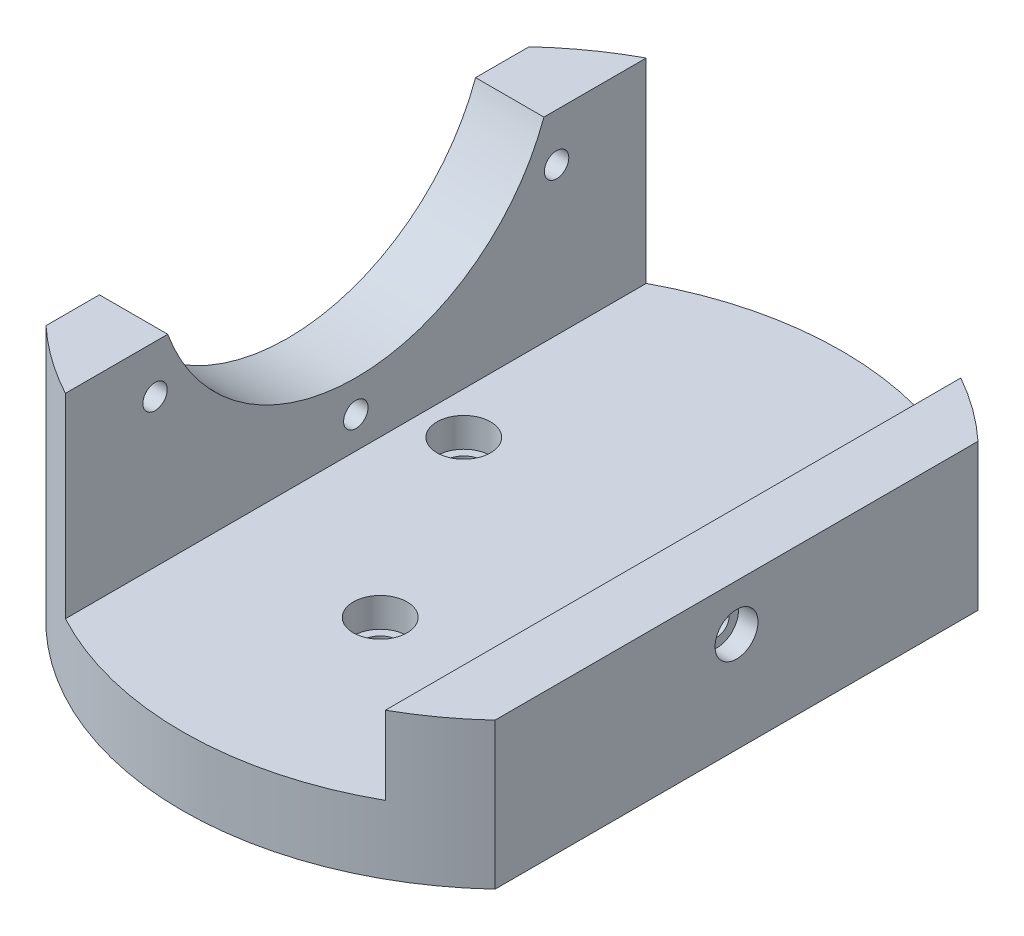
ISO-10303-21;
HEADER;
FILE_DESCRIPTION(('STEP AP214'),'2;1');
FILE_NAME('part.step','',(''),(''),'','','');
FILE_SCHEMA(('AUTOMOTIVE_DESIGN { 1 0 10303 214 1 1 1 1 }'));
ENDSEC;
DATA;
#1=APPLICATION_CONTEXT('core data for automotive mechanical design processes');
#2=APPLICATION_PROTOCOL_DEFINITION('international standard','automotive_design',2000,#1);
#3=PRODUCT_CONTEXT('',#1,'mechanical');
#4=PRODUCT('Part','Part','',(#3));
#5=PRODUCT_RELATED_PRODUCT_CATEGORY('part','',(#4));
#6=PRODUCT_DEFINITION_FORMATION('','',#4);
#7=PRODUCT_DEFINITION_CONTEXT('part definition',#1,'design');
#8=PRODUCT_DEFINITION('design','',#6,#7);
#9=PRODUCT_DEFINITION_SHAPE('','',#8);
#10=(LENGTH_UNIT() NAMED_UNIT(*) SI_UNIT(.MILLI.,.METRE.));
#11=(NAMED_UNIT(*) PLANE_ANGLE_UNIT() SI_UNIT($,.RADIAN.));
#12=(NAMED_UNIT(*) SI_UNIT($,.STERADIAN.) SOLID_ANGLE_UNIT());
#13=UNCERTAINTY_MEASURE_WITH_UNIT(LENGTH_MEASURE(1.E-05),#10,'distance_accuracy_value','');
#14=(GEOMETRIC_REPRESENTATION_CONTEXT(3) GLOBAL_UNCERTAINTY_ASSIGNED_CONTEXT((#13)) GLOBAL_UNIT_ASSIGNED_CONTEXT((#10,
#11,#12)) REPRESENTATION_CONTEXT('',''));
#15=CARTESIAN_POINT('',(0.,0.,0.));
#16=DIRECTION('',(0.,0.,1.));
#17=DIRECTION('',(1.,0.,0.));
#18=AXIS2_PLACEMENT_3D('',#15,#16,#17);
#19=CARTESIAN_POINT('',(15.5,10.25,0.));
#20=DIRECTION('',(1.,0.,0.));
#21=DIRECTION('',(0.,0.,-1.));
#22=AXIS2_PLACEMENT_3D('',#19,#20,#21);
#23=CYLINDRICAL_SURFACE('',#22,1.25);
#24=CARTESIAN_POINT('',(16.5,10.25,0.));
#25=DIRECTION('',(1.,0.,0.));
#26=DIRECTION('',(0.,0.,-1.));
#27=AXIS2_PLACEMENT_3D('',#24,#25,#26);
#28=CIRCLE('',#27,1.25);
#29=CARTESIAN_POINT('',(16.5,10.25,-1.25));
#30=VERTEX_POINT('',#29);
#31=EDGE_CURVE('E264',#30,#30,#28,.T.);
#32=ORIENTED_EDGE('',*,*,#31,.F.);
#33=EDGE_LOOP('',(#32));
#34=FACE_BOUND('',#33,.T.);
#35=CARTESIAN_POINT('',(21.,10.25,0.));
#36=DIRECTION('',(1.,0.,0.));
#37=DIRECTION('',(0.,0.,-1.));
#38=AXIS2_PLACEMENT_3D('',#35,#36,#37);
#39=CIRCLE('',#38,1.25);
#40=CARTESIAN_POINT('',(21.,10.25,-1.25));
#41=VERTEX_POINT('',#40);
#42=EDGE_CURVE('E45',#41,#41,#39,.F.);
#43=ORIENTED_EDGE('',*,*,#42,.F.);
#44=EDGE_LOOP('',(#43));
#45=FACE_BOUND('',#44,.T.);
#46=ADVANCED_FACE('F41',(#34,#45),#23,.F.);
#47=CARTESIAN_POINT('',(0.,7.,0.));
#48=DIRECTION('',(0.,1.,0.));
#49=DIRECTION('',(0.,0.,1.));
#50=AXIS2_PLACEMENT_3D('',#47,#48,#49);
#51=PLANE('',#50);
#52=CARTESIAN_POINT('',(-11.6913429510898,7.,-6.75000000000014));
#53=DIRECTION('',(0.,1.,0.));
#54=DIRECTION('',(0.,0.,1.));
#55=AXIS2_PLACEMENT_3D('',#52,#53,#54);
#56=CIRCLE('',#55,2.75);
#57=CARTESIAN_POINT('',(-11.6913429510898,7.,-4.00000000000014));
#58=VERTEX_POINT('',#57);
#59=EDGE_CURVE('E205',#58,#58,#56,.T.);
#60=ORIENTED_EDGE('',*,*,#59,.F.);
#61=EDGE_LOOP('',(#60));
#62=FACE_BOUND('',#61,.T.);
#63=CARTESIAN_POINT('',(11.6913429510899,7.,-6.74999999999997));
#64=DIRECTION('',(0.,1.,0.));
#65=DIRECTION('',(0.,0.,1.));
#66=AXIS2_PLACEMENT_3D('',#63,#64,#65);
#67=CIRCLE('',#66,2.75);
#68=CARTESIAN_POINT('',(11.6913429510899,7.,-3.99999999999998));
#69=VERTEX_POINT('',#68);
#70=EDGE_CURVE('E208',#69,#69,#67,.T.);
#71=ORIENTED_EDGE('',*,*,#70,.F.);
#72=EDGE_LOOP('',(#71));
#73=FACE_BOUND('',#72,.T.);
#74=CARTESIAN_POINT('',(0.,7.,13.5));
#75=DIRECTION('',(0.,1.,0.));
#76=DIRECTION('',(0.,0.,1.));
#77=AXIS2_PLACEMENT_3D('',#74,#75,#76);
#78=CIRCLE('',#77,2.75);
#79=CARTESIAN_POINT('',(0.,7.,16.25));
#80=VERTEX_POINT('',#79);
#81=EDGE_CURVE('E214',#80,#80,#78,.T.);
#82=ORIENTED_EDGE('',*,*,#81,.F.);
#83=EDGE_LOOP('',(#82));
#84=FACE_BOUND('',#83,.T.);
#85=CARTESIAN_POINT('',(0.,7.,0.));
#86=DIRECTION('',(0.,1.,0.));
#87=DIRECTION('',(0.,0.,1.));
#88=AXIS2_PLACEMENT_3D('',#85,#86,#87);
#89=CIRCLE('',#88,33.7790111417605);
#90=CARTESIAN_POINT('',(-16.,7.,29.7493124914708));
#91=VERTEX_POINT('',#90);
#92=CARTESIAN_POINT('',(16.5,7.,29.4749316151061));
#93=VERTEX_POINT('',#92);
#94=EDGE_CURVE('E63',#91,#93,#89,.T.);
#95=ORIENTED_EDGE('',*,*,#94,.T.);
#96=DIRECTION('',(0.,0.,1.));
#97=VECTOR('',#96,1.);
#98=CARTESIAN_POINT('',(16.5,7.,-29.4749316151061));
#99=LINE('',#98,#97);
#100=CARTESIAN_POINT('',(16.5,7.,-29.4749316151061));
#101=VERTEX_POINT('',#100);
#102=EDGE_CURVE('E58',#101,#93,#99,.T.);
#103=ORIENTED_EDGE('',*,*,#102,.F.);
#104=CARTESIAN_POINT('',(0.,7.,0.));
#105=DIRECTION('',(0.,1.,0.));
#106=DIRECTION('',(0.,0.,1.));
#107=AXIS2_PLACEMENT_3D('',#104,#105,#106);
#108=CIRCLE('',#107,33.7790111417605);
#109=CARTESIAN_POINT('',(-16.,7.,-29.7493124914708));
#110=VERTEX_POINT('',#109);
#111=EDGE_CURVE('E140',#101,#110,#108,.T.);
#112=ORIENTED_EDGE('',*,*,#111,.T.);
#113=DIRECTION('',(0.,0.,-1.));
#114=VECTOR('',#113,1.);
#115=CARTESIAN_POINT('',(-16.,7.,-29.7493124914708));
#116=LINE('',#115,#114);
#117=EDGE_CURVE('E179',#91,#110,#116,.T.);
#118=ORIENTED_EDGE('',*,*,#117,.F.);
#119=EDGE_LOOP('',(#95,#103,#112,#118));
#120=FACE_BOUND('',#119,.T.);
#121=ADVANCED_FACE('F306',(#62,#73,#84,#120),#51,.T.);
#122=CARTESIAN_POINT('',(-35.5,22.1249999999998,-20.5681033398803));
#123=DIRECTION('',(1.,0.,0.));
#124=DIRECTION('',(0.,0.,-1.));
#125=AXIS2_PLACEMENT_3D('',#122,#123,#124);
#126=CYLINDRICAL_SURFACE('',#125,1.25);
#127=CARTESIAN_POINT('',(-16.,22.1249999999998,-20.5681033398803));
#128=DIRECTION('',(1.,0.,0.));
#129=DIRECTION('',(0.,0.,-1.));
#130=AXIS2_PLACEMENT_3D('',#127,#128,#129);
#131=CIRCLE('',#130,1.25);
#132=CARTESIAN_POINT('',(-16.,22.1249999999998,-21.8181033398803));
#133=VERTEX_POINT('',#132);
#134=EDGE_CURVE('E171',#133,#133,#131,.T.);
#135=ORIENTED_EDGE('',*,*,#134,.T.);
#136=EDGE_LOOP('',(#135));
#137=FACE_BOUND('',#136,.T.);
#138=CARTESIAN_POINT('',(-21.,22.1249999999998,-20.5681033398803));
#139=DIRECTION('',(-1.,0.,0.));
#140=DIRECTION('',(0.,0.,1.));
#141=AXIS2_PLACEMENT_3D('',#138,#139,#140);
#142=CIRCLE('',#141,1.25);
#143=CARTESIAN_POINT('',(-21.,22.1249999999998,-19.3181033398803));
#144=VERTEX_POINT('',#143);
#145=EDGE_CURVE('E174',#144,#144,#142,.F.);
#146=ORIENTED_EDGE('',*,*,#145,.F.);
#147=EDGE_LOOP('',(#146));
#148=FACE_BOUND('',#147,.T.);
#149=ADVANCED_FACE('F335',(#137,#148),#126,.F.);
#150=CARTESIAN_POINT('',(-35.5,22.125,20.5681033398804));
#151=DIRECTION('',(1.,0.,0.));
#152=DIRECTION('',(0.,0.,-1.));
#153=AXIS2_PLACEMENT_3D('',#150,#151,#152);
#154=CYLINDRICAL_SURFACE('',#153,1.25);
#155=CARTESIAN_POINT('',(-16.,22.125,20.5681033398804));
#156=DIRECTION('',(1.,0.,0.));
#157=DIRECTION('',(0.,0.,-1.));
#158=AXIS2_PLACEMENT_3D('',#155,#156,#157);
#159=CIRCLE('',#158,1.25);
#160=CARTESIAN_POINT('',(-16.,22.125,19.3181033398805));
#161=VERTEX_POINT('',#160);
#162=EDGE_CURVE('E168',#161,#161,#159,.T.);
#163=ORIENTED_EDGE('',*,*,#162,.T.);
#164=EDGE_LOOP('',(#163));
#165=FACE_BOUND('',#164,.T.);
#166=CARTESIAN_POINT('',(-21.,22.125,20.5681033398804));
#167=DIRECTION('',(-1.,0.,0.));
#168=DIRECTION('',(0.,0.,1.));
#169=AXIS2_PLACEMENT_3D('',#166,#167,#168);
#170=CIRCLE('',#169,1.25);
#171=CARTESIAN_POINT('',(-21.,22.125,21.8181033398804));
#172=VERTEX_POINT('',#171);
#173=EDGE_CURVE('E260',#172,#172,#170,.F.);
#174=ORIENTED_EDGE('',*,*,#173,.F.);
#175=EDGE_LOOP('',(#174));
#176=FACE_BOUND('',#175,.T.);
#177=ADVANCED_FACE('F369',(#165,#176),#154,.F.);
#178=CARTESIAN_POINT('',(-35.5,10.25,0.));
#179=DIRECTION('',(1.,0.,0.));
#180=DIRECTION('',(0.,0.,-1.));
#181=AXIS2_PLACEMENT_3D('',#178,#179,#180);
#182=CYLINDRICAL_SURFACE('',#181,1.25);
#183=CARTESIAN_POINT('',(-16.,10.25,0.));
#184=DIRECTION('',(1.,0.,0.));
#185=DIRECTION('',(0.,0.,-1.));
#186=AXIS2_PLACEMENT_3D('',#183,#184,#185);
#187=CIRCLE('',#186,1.25);
#188=CARTESIAN_POINT('',(-16.,10.25,-1.25));
#189=VERTEX_POINT('',#188);
#190=EDGE_CURVE('E164',#189,#189,#187,.T.);
#191=ORIENTED_EDGE('',*,*,#190,.T.);
#192=EDGE_LOOP('',(#191));
#193=FACE_BOUND('',#192,.T.);
#194=CARTESIAN_POINT('',(-21.,10.25,0.));
#195=DIRECTION('',(-1.,0.,0.));
#196=DIRECTION('',(0.,0.,1.));
#197=AXIS2_PLACEMENT_3D('',#194,#195,#196);
#198=CIRCLE('',#197,1.25);
#199=CARTESIAN_POINT('',(-21.,10.25,1.25));
#200=VERTEX_POINT('',#199);
#201=EDGE_CURVE('E152',#200,#200,#198,.F.);
#202=ORIENTED_EDGE('',*,*,#201,.F.);
#203=EDGE_LOOP('',(#202));
#204=FACE_BOUND('',#203,.T.);
#205=ADVANCED_FACE('F366',(#193,#204),#182,.F.);
#206=CARTESIAN_POINT('',(0.,27.,0.));
#207=DIRECTION('',(0.,1.,0.));
#208=DIRECTION('',(0.,0.,1.));
#209=AXIS2_PLACEMENT_3D('',#206,#207,#208);
#210=PLANE('',#209);
#211=DIRECTION('',(1.,0.,0.));
#212=VECTOR('',#211,1.);
#213=CARTESIAN_POINT('',(-35.5,27.,19.2678488679977));
#214=LINE('',#213,#212);
#215=CARTESIAN_POINT('',(-23.,27.,19.2678488679977));
#216=VERTEX_POINT('',#215);
#217=CARTESIAN_POINT('',(-16.,27.,19.2678488679977));
#218=VERTEX_POINT('',#217);
#219=EDGE_CURVE('E11',#216,#218,#214,.T.);
#220=ORIENTED_EDGE('',*,*,#219,.F.);
#221=DIRECTION('',(0.,0.,1.));
#222=VECTOR('',#221,1.);
#223=CARTESIAN_POINT('',(-23.,27.,-24.7390701869569));
#224=LINE('',#223,#222);
#225=CARTESIAN_POINT('',(-23.,27.,24.7390701869569));
#226=VERTEX_POINT('',#225);
#227=EDGE_CURVE('E183',#216,#226,#224,.T.);
#228=ORIENTED_EDGE('',*,*,#227,.T.);
#229=CARTESIAN_POINT('',(0.,27.,0.));
#230=DIRECTION('',(0.,1.,0.));
#231=DIRECTION('',(0.,0.,1.));
#232=AXIS2_PLACEMENT_3D('',#229,#230,#231);
#233=CIRCLE('',#232,33.7790111417605);
#234=CARTESIAN_POINT('',(-16.,27.,29.7493124914708));
#235=VERTEX_POINT('',#234);
#236=EDGE_CURVE('E187',#226,#235,#233,.T.);
#237=ORIENTED_EDGE('',*,*,#236,.T.);
#238=DIRECTION('',(0.,0.,-1.));
#239=VECTOR('',#238,1.);
#240=CARTESIAN_POINT('',(-16.,27.,-29.7493124914708));
#241=LINE('',#240,#239);
#242=EDGE_CURVE('E190',#235,#218,#241,.T.);
#243=ORIENTED_EDGE('',*,*,#242,.T.);
#244=EDGE_LOOP('',(#220,#228,#237,#243));
#245=FACE_BOUND('',#244,.T.);
#246=ADVANCED_FACE('F311',(#245),#210,.T.);
#247=CARTESIAN_POINT('',(11.6913429510899,7.,-6.74999999999997));
#248=DIRECTION('',(0.,-1.,0.));
#249=DIRECTION('',(0.,0.,-1.));
#250=AXIS2_PLACEMENT_3D('',#247,#248,#249);
#251=CYLINDRICAL_SURFACE('',#250,1.91201949859022);
#252=CARTESIAN_POINT('',(11.6913429510899,0.,-6.74999999999997));
#253=DIRECTION('',(0.,1.,0.));
#254=DIRECTION('',(0.,0.,1.));
#255=AXIS2_PLACEMENT_3D('',#252,#253,#254);
#256=CIRCLE('',#255,1.91201949859022);
#257=CARTESIAN_POINT('',(11.6913429510899,0.,-4.83798050140976));
#258=VERTEX_POINT('',#257);
#259=EDGE_CURVE('E226',#258,#258,#256,.T.);
#260=ORIENTED_EDGE('',*,*,#259,.F.);
#261=EDGE_LOOP('',(#260));
#262=FACE_BOUND('',#261,.T.);
#263=CARTESIAN_POINT('',(11.6913429510899,4.,-6.74999999999997));
#264=DIRECTION('',(0.,1.,0.));
#265=DIRECTION('',(0.,0.,1.));
#266=AXIS2_PLACEMENT_3D('',#263,#264,#265);
#267=CIRCLE('',#266,1.91201949859022);
#268=CARTESIAN_POINT('',(11.6913429510899,4.,-4.83798050140976));
#269=VERTEX_POINT('',#268);
#270=EDGE_CURVE('E223',#269,#269,#267,.T.);
#271=ORIENTED_EDGE('',*,*,#270,.T.);
#272=EDGE_LOOP('',(#271));
#273=FACE_BOUND('',#272,.T.);
#274=ADVANCED_FACE('F420',(#262,#273),#251,.F.);
#275=CARTESIAN_POINT('',(0.,7.,13.5));
#276=DIRECTION('',(0.,-1.,0.));
#277=DIRECTION('',(0.,0.,-1.));
#278=AXIS2_PLACEMENT_3D('',#275,#276,#277);
#279=CYLINDRICAL_SURFACE('',#278,1.91201949859022);
#280=CARTESIAN_POINT('',(0.,0.,13.5));
#281=DIRECTION('',(0.,1.,0.));
#282=DIRECTION('',(0.,0.,1.));
#283=AXIS2_PLACEMENT_3D('',#280,#281,#282);
#284=CIRCLE('',#283,1.91201949859022);
#285=CARTESIAN_POINT('',(0.,0.,15.4120194985902));
#286=VERTEX_POINT('',#285);
#287=EDGE_CURVE('E222',#286,#286,#284,.T.);
#288=ORIENTED_EDGE('',*,*,#287,.F.);
#289=EDGE_LOOP('',(#288));
#290=FACE_BOUND('',#289,.T.);
#291=CARTESIAN_POINT('',(0.,4.,13.5));
#292=DIRECTION('',(0.,1.,0.));
#293=DIRECTION('',(0.,0.,1.));
#294=AXIS2_PLACEMENT_3D('',#291,#292,#293);
#295=CIRCLE('',#294,1.91201949859022);
#296=CARTESIAN_POINT('',(0.,4.,15.4120194985902));
#297=VERTEX_POINT('',#296);
#298=EDGE_CURVE('E252',#297,#297,#295,.T.);
#299=ORIENTED_EDGE('',*,*,#298,.T.);
#300=EDGE_LOOP('',(#299));
#301=FACE_BOUND('',#300,.T.);
#302=ADVANCED_FACE('F416',(#290,#301),#279,.F.);
#303=CARTESIAN_POINT('',(-11.6913429510898,7.,-6.75000000000014));
#304=DIRECTION('',(0.,-1.,0.));
#305=DIRECTION('',(0.,0.,-1.));
#306=AXIS2_PLACEMENT_3D('',#303,#304,#305);
#307=CYLINDRICAL_SURFACE('',#306,1.91201949859022);
#308=CARTESIAN_POINT('',(-11.6913429510898,0.,-6.75000000000014));
#309=DIRECTION('',(0.,1.,0.));
#310=DIRECTION('',(0.,0.,1.));
#311=AXIS2_PLACEMENT_3D('',#308,#309,#310);
#312=CIRCLE('',#311,1.91201949859022);
#313=CARTESIAN_POINT('',(-11.6913429510898,0.,-4.83798050140992));
#314=VERTEX_POINT('',#313);
#315=EDGE_CURVE('E219',#314,#314,#312,.T.);
#316=ORIENTED_EDGE('',*,*,#315,.F.);
#317=EDGE_LOOP('',(#316));
#318=FACE_BOUND('',#317,.T.);
#319=CARTESIAN_POINT('',(-11.6913429510898,4.,-6.75000000000014));
#320=DIRECTION('',(0.,1.,0.));
#321=DIRECTION('',(0.,0.,1.));
#322=AXIS2_PLACEMENT_3D('',#319,#320,#321);
#323=CIRCLE('',#322,1.91201949859022);
#324=CARTESIAN_POINT('',(-11.6913429510898,4.,-4.83798050140992));
#325=VERTEX_POINT('',#324);
#326=EDGE_CURVE('E204',#325,#325,#323,.T.);
#327=ORIENTED_EDGE('',*,*,#326,.T.);
#328=EDGE_LOOP('',(#327));
#329=FACE_BOUND('',#328,.T.);
#330=ADVANCED_FACE('F413',(#318,#329),#307,.F.);
#331=CARTESIAN_POINT('',(0.,0.,0.));
#332=DIRECTION('',(0.,1.,0.));
#333=DIRECTION('',(0.,0.,1.));
#334=AXIS2_PLACEMENT_3D('',#331,#332,#333);
#335=PLANE('',#334);
#336=CARTESIAN_POINT('',(0.,0.,0.));
#337=DIRECTION('',(0.,1.,0.));
#338=DIRECTION('',(0.,0.,1.));
#339=AXIS2_PLACEMENT_3D('',#336,#337,#338);
#340=CIRCLE('',#339,33.7790111417605);
#341=CARTESIAN_POINT('',(23.,0.,-24.7390701869569));
#342=VERTEX_POINT('',#341);
#343=CARTESIAN_POINT('',(-23.,0.,-24.7390701869569));
#344=VERTEX_POINT('',#343);
#345=EDGE_CURVE('E229',#342,#344,#340,.T.);
#346=ORIENTED_EDGE('',*,*,#345,.F.);
#347=DIRECTION('',(0.,0.,-1.));
#348=VECTOR('',#347,1.);
#349=CARTESIAN_POINT('',(23.,0.,24.7390701869569));
#350=LINE('',#349,#348);
#351=CARTESIAN_POINT('',(23.,0.,24.7390701869569));
#352=VERTEX_POINT('',#351);
#353=EDGE_CURVE('E231',#352,#342,#350,.T.);
#354=ORIENTED_EDGE('',*,*,#353,.F.);
#355=CARTESIAN_POINT('',(0.,0.,0.));
#356=DIRECTION('',(0.,1.,0.));
#357=DIRECTION('',(0.,0.,1.));
#358=AXIS2_PLACEMENT_3D('',#355,#356,#357);
#359=CIRCLE('',#358,33.7790111417605);
#360=CARTESIAN_POINT('',(-23.,0.,24.7390701869569));
#361=VERTEX_POINT('',#360);
#362=EDGE_CURVE('E237',#361,#352,#359,.T.);
#363=ORIENTED_EDGE('',*,*,#362,.F.);
#364=DIRECTION('',(0.,0.,1.));
#365=VECTOR('',#364,1.);
#366=CARTESIAN_POINT('',(-23.,0.,-24.7390701869569));
#367=LINE('',#366,#365);
#368=EDGE_CURVE('E235',#344,#361,#367,.T.);
#369=ORIENTED_EDGE('',*,*,#368,.F.);
#370=EDGE_LOOP('',(#346,#354,#363,#369));
#371=FACE_BOUND('',#370,.T.);
#372=ORIENTED_EDGE('',*,*,#259,.T.);
#373=EDGE_LOOP('',(#372));
#374=FACE_BOUND('',#373,.T.);
#375=ORIENTED_EDGE('',*,*,#287,.T.);
#376=EDGE_LOOP('',(#375));
#377=FACE_BOUND('',#376,.T.);
#378=ORIENTED_EDGE('',*,*,#315,.T.);
#379=EDGE_LOOP('',(#378));
#380=FACE_BOUND('',#379,.T.);
#381=ADVANCED_FACE('F287',(#371,#374,#377,#380),#335,.F.);
#382=CARTESIAN_POINT('',(0.,7.,0.));
#383=DIRECTION('',(0.,-1.,0.));
#384=DIRECTION('',(0.,0.,-1.));
#385=AXIS2_PLACEMENT_3D('',#382,#383,#384);
#386=CYLINDRICAL_SURFACE('',#385,33.7790111417605);
#387=ORIENTED_EDGE('',*,*,#345,.T.);
#388=DIRECTION('',(0.,-1.,0.));
#389=VECTOR('',#388,1.);
#390=CARTESIAN_POINT('',(-23.,7.,-24.7390701869569));
#391=LINE('',#390,#389);
#392=CARTESIAN_POINT('',(-23.,27.,-24.7390701869569));
#393=VERTEX_POINT('',#392);
#394=EDGE_CURVE('E247',#393,#344,#391,.T.);
#395=ORIENTED_EDGE('',*,*,#394,.F.);
#396=CARTESIAN_POINT('',(0.,27.,0.));
#397=DIRECTION('',(0.,1.,0.));
#398=DIRECTION('',(0.,0.,1.));
#399=AXIS2_PLACEMENT_3D('',#396,#397,#398);
#400=CIRCLE('',#399,33.7790111417605);
#401=CARTESIAN_POINT('',(-16.,27.,-29.7493124914708));
#402=VERTEX_POINT('',#401);
#403=EDGE_CURVE('E180',#402,#393,#400,.T.);
#404=ORIENTED_EDGE('',*,*,#403,.F.);
#405=DIRECTION('',(0.,-1.,0.));
#406=VECTOR('',#405,1.);
#407=CARTESIAN_POINT('',(-16.,27.,-29.7493124914708));
#408=LINE('',#407,#406);
#409=EDGE_CURVE('E193',#402,#110,#408,.T.);
#410=ORIENTED_EDGE('',*,*,#409,.T.);
#411=ORIENTED_EDGE('',*,*,#111,.F.);
#412=DIRECTION('',(0.,-1.,0.));
#413=VECTOR('',#412,1.);
#414=CARTESIAN_POINT('',(16.5,15.,-29.4749316151061));
#415=LINE('',#414,#413);
#416=CARTESIAN_POINT('',(16.5,15.,-29.4749316151061));
#417=VERTEX_POINT('',#416);
#418=EDGE_CURVE('E121',#417,#101,#415,.T.);
#419=ORIENTED_EDGE('',*,*,#418,.F.);
#420=CARTESIAN_POINT('',(0.,15.,0.));
#421=DIRECTION('',(0.,1.,0.));
#422=DIRECTION('',(0.,0.,1.));
#423=AXIS2_PLACEMENT_3D('',#420,#421,#422);
#424=CIRCLE('',#423,33.7790111417605);
#425=CARTESIAN_POINT('',(23.,15.,-24.7390701869569));
#426=VERTEX_POINT('',#425);
#427=EDGE_CURVE('E128',#426,#417,#424,.T.);
#428=ORIENTED_EDGE('',*,*,#427,.F.);
#429=DIRECTION('',(0.,-1.,0.));
#430=VECTOR('',#429,1.);
#431=CARTESIAN_POINT('',(23.,7.,-24.7390701869569));
#432=LINE('',#431,#430);
#433=EDGE_CURVE('E233',#426,#342,#432,.T.);
#434=ORIENTED_EDGE('',*,*,#433,.T.);
#435=EDGE_LOOP('',(#387,#395,#404,#410,#411,#419,#428,#434));
#436=FACE_BOUND('',#435,.T.);
#437=ADVANCED_FACE('F43',(#436),#386,.T.);
#438=CARTESIAN_POINT('',(-23.,7.,-24.7390701869569));
#439=DIRECTION('',(1.,0.,0.));
#440=DIRECTION('',(0.,0.,-1.));
#441=AXIS2_PLACEMENT_3D('',#438,#439,#440);
#442=PLANE('',#441);
#443=CARTESIAN_POINT('',(-23.,22.1249999999998,-20.5681033398803));
#444=DIRECTION('',(-1.,0.,0.));
#445=DIRECTION('',(0.,0.,1.));
#446=AXIS2_PLACEMENT_3D('',#443,#444,#445);
#447=CIRCLE('',#446,2.2);
#448=CARTESIAN_POINT('',(-23.,22.1249999999998,-18.3681033398803));
#449=VERTEX_POINT('',#448);
#450=EDGE_CURVE('E153',#449,#449,#447,.T.);
#451=ORIENTED_EDGE('',*,*,#450,.F.);
#452=EDGE_LOOP('',(#451));
#453=FACE_BOUND('',#452,.T.);
#454=CARTESIAN_POINT('',(-23.,10.25,0.));
#455=DIRECTION('',(-1.,0.,0.));
#456=DIRECTION('',(0.,0.,1.));
#457=AXIS2_PLACEMENT_3D('',#454,#455,#456);
#458=CIRCLE('',#457,2.2);
#459=CARTESIAN_POINT('',(-23.,10.25,2.2));
#460=VERTEX_POINT('',#459);
#461=EDGE_CURVE('E156',#460,#460,#458,.T.);
#462=ORIENTED_EDGE('',*,*,#461,.F.);
#463=EDGE_LOOP('',(#462));
#464=FACE_BOUND('',#463,.T.);
#465=CARTESIAN_POINT('',(-23.,22.125,20.5681033398804));
#466=DIRECTION('',(-1.,0.,0.));
#467=DIRECTION('',(0.,0.,1.));
#468=AXIS2_PLACEMENT_3D('',#465,#466,#467);
#469=CIRCLE('',#468,2.2);
#470=CARTESIAN_POINT('',(-23.,22.125,22.7681033398804));
#471=VERTEX_POINT('',#470);
#472=EDGE_CURVE('E144',#471,#471,#469,.T.);
#473=ORIENTED_EDGE('',*,*,#472,.F.);
#474=EDGE_LOOP('',(#473));
#475=FACE_BOUND('',#474,.T.);
#476=ORIENTED_EDGE('',*,*,#227,.F.);
#477=CARTESIAN_POINT('',(-23.,34.,0.));
#478=DIRECTION('',(1.,0.,0.));
#479=DIRECTION('',(0.,0.,-1.));
#480=AXIS2_PLACEMENT_3D('',#477,#478,#479);
#481=CIRCLE('',#480,20.5);
#482=CARTESIAN_POINT('',(-23.,27.,-19.2678488679977));
#483=VERTEX_POINT('',#482);
#484=EDGE_CURVE('E176',#216,#483,#481,.T.);
#485=ORIENTED_EDGE('',*,*,#484,.T.);
#486=EDGE_CURVE('E184',#393,#483,#224,.T.);
#487=ORIENTED_EDGE('',*,*,#486,.F.);
#488=ORIENTED_EDGE('',*,*,#394,.T.);
#489=ORIENTED_EDGE('',*,*,#368,.T.);
#490=DIRECTION('',(0.,-1.,0.));
#491=VECTOR('',#490,1.);
#492=CARTESIAN_POINT('',(-23.,7.,24.7390701869569));
#493=LINE('',#492,#491);
#494=EDGE_CURVE('E244',#226,#361,#493,.T.);
#495=ORIENTED_EDGE('',*,*,#494,.F.);
#496=EDGE_LOOP('',(#476,#485,#487,#488,#489,#495));
#497=FACE_BOUND('',#496,.T.);
#498=ADVANCED_FACE('F294',(#453,#464,#475,#497),#442,.F.);
#499=CARTESIAN_POINT('',(0.,7.,0.));
#500=DIRECTION('',(0.,-1.,0.));
#501=DIRECTION('',(0.,0.,-1.));
#502=AXIS2_PLACEMENT_3D('',#499,#500,#501);
#503=CYLINDRICAL_SURFACE('',#502,33.7790111417605);
#504=ORIENTED_EDGE('',*,*,#362,.T.);
#505=DIRECTION('',(0.,-1.,0.));
#506=VECTOR('',#505,1.);
#507=CARTESIAN_POINT('',(23.,7.,24.7390701869569));
#508=LINE('',#507,#506);
#509=CARTESIAN_POINT('',(23.,15.,24.7390701869569));
#510=VERTEX_POINT('',#509);
#511=EDGE_CURVE('E241',#510,#352,#508,.T.);
#512=ORIENTED_EDGE('',*,*,#511,.F.);
#513=CARTESIAN_POINT('',(0.,15.,0.));
#514=DIRECTION('',(0.,1.,0.));
#515=DIRECTION('',(0.,0.,1.));
#516=AXIS2_PLACEMENT_3D('',#513,#514,#515);
#517=CIRCLE('',#516,33.7790111417605);
#518=CARTESIAN_POINT('',(16.5,15.,29.4749316151061));
#519=VERTEX_POINT('',#518);
#520=EDGE_CURVE('E127',#519,#510,#517,.T.);
#521=ORIENTED_EDGE('',*,*,#520,.F.);
#522=DIRECTION('',(0.,-1.,0.));
#523=VECTOR('',#522,1.);
#524=CARTESIAN_POINT('',(16.5,15.,29.4749316151061));
#525=LINE('',#524,#523);
#526=EDGE_CURVE('E123',#519,#93,#525,.T.);
#527=ORIENTED_EDGE('',*,*,#526,.T.);
#528=ORIENTED_EDGE('',*,*,#94,.F.);
#529=DIRECTION('',(0.,-1.,0.));
#530=VECTOR('',#529,1.);
#531=CARTESIAN_POINT('',(-16.,27.,29.7493124914708));
#532=LINE('',#531,#530);
#533=EDGE_CURVE('E197',#235,#91,#532,.T.);
#534=ORIENTED_EDGE('',*,*,#533,.F.);
#535=ORIENTED_EDGE('',*,*,#236,.F.);
#536=ORIENTED_EDGE('',*,*,#494,.T.);
#537=EDGE_LOOP('',(#504,#512,#521,#527,#528,#534,#535,#536));
#538=FACE_BOUND('',#537,.T.);
#539=ADVANCED_FACE('F307',(#538),#503,.T.);
#540=CARTESIAN_POINT('',(23.,7.,24.7390701869569));
#541=DIRECTION('',(-1.,0.,0.));
#542=DIRECTION('',(0.,0.,1.));
#543=AXIS2_PLACEMENT_3D('',#540,#541,#542);
#544=PLANE('',#543);
#545=CARTESIAN_POINT('',(23.,10.25,0.));
#546=DIRECTION('',(1.,0.,0.));
#547=DIRECTION('',(0.,0.,-1.));
#548=AXIS2_PLACEMENT_3D('',#545,#546,#547);
#549=CIRCLE('',#548,2.2);
#550=CARTESIAN_POINT('',(23.,10.25,-2.2));
#551=VERTEX_POINT('',#550);
#552=EDGE_CURVE('E273',#551,#551,#549,.T.);
#553=ORIENTED_EDGE('',*,*,#552,.F.);
#554=EDGE_LOOP('',(#553));
#555=FACE_BOUND('',#554,.T.);
#556=ORIENTED_EDGE('',*,*,#353,.T.);
#557=ORIENTED_EDGE('',*,*,#433,.F.);
#558=DIRECTION('',(0.,0.,-1.));
#559=VECTOR('',#558,1.);
#560=CARTESIAN_POINT('',(23.,15.,-24.7390701869569));
#561=LINE('',#560,#559);
#562=EDGE_CURVE('E134',#510,#426,#561,.T.);
#563=ORIENTED_EDGE('',*,*,#562,.F.);
#564=ORIENTED_EDGE('',*,*,#511,.T.);
#565=EDGE_LOOP('',(#556,#557,#563,#564));
#566=FACE_BOUND('',#565,.T.);
#567=ADVANCED_FACE('F283',(#555,#566),#544,.F.);
#568=CARTESIAN_POINT('',(-11.6913429510898,4.,-6.75000000000014));
#569=DIRECTION('',(0.,1.,0.));
#570=DIRECTION('',(0.,0.,1.));
#571=AXIS2_PLACEMENT_3D('',#568,#569,#570);
#572=CYLINDRICAL_SURFACE('',#571,2.75);
#573=CARTESIAN_POINT('',(-11.6913429510898,4.,-6.75000000000014));
#574=DIRECTION('',(0.,1.,0.));
#575=DIRECTION('',(0.,0.,1.));
#576=AXIS2_PLACEMENT_3D('',#573,#574,#575);
#577=CIRCLE('',#576,2.75);
#578=CARTESIAN_POINT('',(-11.6913429510898,4.,-4.00000000000014));
#579=VERTEX_POINT('',#578);
#580=EDGE_CURVE('E201',#579,#579,#577,.T.);
#581=ORIENTED_EDGE('',*,*,#580,.F.);
#582=EDGE_LOOP('',(#581));
#583=FACE_BOUND('',#582,.T.);
#584=ORIENTED_EDGE('',*,*,#59,.T.);
#585=EDGE_LOOP('',(#584));
#586=FACE_BOUND('',#585,.T.);
#587=ADVANCED_FACE('F398',(#583,#586),#572,.F.);
#588=CARTESIAN_POINT('',(-11.6913429510898,4.,-6.75000000000014));
#589=DIRECTION('',(0.,1.,0.));
#590=DIRECTION('',(0.,0.,1.));
#591=AXIS2_PLACEMENT_3D('',#588,#589,#590);
#592=PLANE('',#591);
#593=ORIENTED_EDGE('',*,*,#326,.F.);
#594=EDGE_LOOP('',(#593));
#595=FACE_BOUND('',#594,.T.);
#596=ORIENTED_EDGE('',*,*,#580,.T.);
#597=EDGE_LOOP('',(#596));
#598=FACE_BOUND('',#597,.T.);
#599=ADVANCED_FACE('F394',(#595,#598),#592,.T.);
#600=CARTESIAN_POINT('',(0.,4.,13.5));
#601=DIRECTION('',(0.,1.,0.));
#602=DIRECTION('',(0.,0.,1.));
#603=AXIS2_PLACEMENT_3D('',#600,#601,#602);
#604=CYLINDRICAL_SURFACE('',#603,2.75);
#605=CARTESIAN_POINT('',(0.,4.,13.5));
#606=DIRECTION('',(0.,1.,0.));
#607=DIRECTION('',(0.,0.,1.));
#608=AXIS2_PLACEMENT_3D('',#605,#606,#607);
#609=CIRCLE('',#608,2.75);
#610=CARTESIAN_POINT('',(0.,4.,16.25));
#611=VERTEX_POINT('',#610);
#612=EDGE_CURVE('E200',#611,#611,#609,.T.);
#613=ORIENTED_EDGE('',*,*,#612,.F.);
#614=EDGE_LOOP('',(#613));
#615=FACE_BOUND('',#614,.T.);
#616=ORIENTED_EDGE('',*,*,#81,.T.);
#617=EDGE_LOOP('',(#616));
#618=FACE_BOUND('',#617,.T.);
#619=ADVANCED_FACE('F397',(#615,#618),#604,.F.);
#620=CARTESIAN_POINT('',(0.,4.,13.5));
#621=DIRECTION('',(0.,1.,0.));
#622=DIRECTION('',(0.,0.,1.));
#623=AXIS2_PLACEMENT_3D('',#620,#621,#622);
#624=PLANE('',#623);
#625=ORIENTED_EDGE('',*,*,#298,.F.);
#626=EDGE_LOOP('',(#625));
#627=FACE_BOUND('',#626,.T.);
#628=ORIENTED_EDGE('',*,*,#612,.T.);
#629=EDGE_LOOP('',(#628));
#630=FACE_BOUND('',#629,.T.);
#631=ADVANCED_FACE('F404',(#627,#630),#624,.T.);
#632=CARTESIAN_POINT('',(11.6913429510899,4.,-6.74999999999997));
#633=DIRECTION('',(0.,1.,0.));
#634=DIRECTION('',(0.,0.,1.));
#635=AXIS2_PLACEMENT_3D('',#632,#633,#634);
#636=CYLINDRICAL_SURFACE('',#635,2.75);
#637=CARTESIAN_POINT('',(11.6913429510899,4.,-6.74999999999997));
#638=DIRECTION('',(0.,1.,0.));
#639=DIRECTION('',(0.,0.,1.));
#640=AXIS2_PLACEMENT_3D('',#637,#638,#639);
#641=CIRCLE('',#640,2.75);
#642=CARTESIAN_POINT('',(11.6913429510899,4.,-3.99999999999998));
#643=VERTEX_POINT('',#642);
#644=EDGE_CURVE('E211',#643,#643,#641,.T.);
#645=ORIENTED_EDGE('',*,*,#644,.F.);
#646=EDGE_LOOP('',(#645));
#647=FACE_BOUND('',#646,.T.);
#648=ORIENTED_EDGE('',*,*,#70,.T.);
#649=EDGE_LOOP('',(#648));
#650=FACE_BOUND('',#649,.T.);
#651=ADVANCED_FACE('F388',(#647,#650),#636,.F.);
#652=CARTESIAN_POINT('',(11.6913429510899,4.,-6.74999999999997));
#653=DIRECTION('',(0.,1.,0.));
#654=DIRECTION('',(0.,0.,1.));
#655=AXIS2_PLACEMENT_3D('',#652,#653,#654);
#656=PLANE('',#655);
#657=ORIENTED_EDGE('',*,*,#270,.F.);
#658=EDGE_LOOP('',(#657));
#659=FACE_BOUND('',#658,.T.);
#660=ORIENTED_EDGE('',*,*,#644,.T.);
#661=EDGE_LOOP('',(#660));
#662=FACE_BOUND('',#661,.T.);
#663=ADVANCED_FACE('F382',(#659,#662),#656,.T.);
#664=CARTESIAN_POINT('',(-16.,27.,-29.7493124914708));
#665=DIRECTION('',(-1.,0.,0.));
#666=DIRECTION('',(0.,0.,1.));
#667=AXIS2_PLACEMENT_3D('',#664,#665,#666);
#668=PLANE('',#667);
#669=ORIENTED_EDGE('',*,*,#190,.F.);
#670=EDGE_LOOP('',(#669));
#671=FACE_BOUND('',#670,.T.);
#672=ORIENTED_EDGE('',*,*,#162,.F.);
#673=EDGE_LOOP('',(#672));
#674=FACE_BOUND('',#673,.T.);
#675=ORIENTED_EDGE('',*,*,#134,.F.);
#676=EDGE_LOOP('',(#675));
#677=FACE_BOUND('',#676,.T.);
#678=CARTESIAN_POINT('',(-16.,27.,-19.2678488679977));
#679=VERTEX_POINT('',#678);
#680=EDGE_CURVE('E189',#679,#402,#241,.T.);
#681=ORIENTED_EDGE('',*,*,#680,.F.);
#682=CARTESIAN_POINT('',(-16.,34.,0.));
#683=DIRECTION('',(1.,0.,0.));
#684=DIRECTION('',(0.,0.,-1.));
#685=AXIS2_PLACEMENT_3D('',#682,#683,#684);
#686=CIRCLE('',#685,20.5);
#687=EDGE_CURVE('E167',#218,#679,#686,.T.);
#688=ORIENTED_EDGE('',*,*,#687,.F.);
#689=ORIENTED_EDGE('',*,*,#242,.F.);
#690=ORIENTED_EDGE('',*,*,#533,.T.);
#691=ORIENTED_EDGE('',*,*,#117,.T.);
#692=ORIENTED_EDGE('',*,*,#409,.F.);
#693=EDGE_LOOP('',(#681,#688,#689,#690,#691,#692));
#694=FACE_BOUND('',#693,.T.);
#695=ADVANCED_FACE('F303',(#671,#674,#677,#694),#668,.F.);
#696=DIRECTION('',(1.,0.,0.));
#697=VECTOR('',#696,1.);
#698=CARTESIAN_POINT('',(-35.5,27.,-19.2678488679977));
#699=LINE('',#698,#697);
#700=EDGE_CURVE('E50',#679,#483,#699,.F.);
#701=ORIENTED_EDGE('',*,*,#700,.F.);
#702=ORIENTED_EDGE('',*,*,#680,.T.);
#703=ORIENTED_EDGE('',*,*,#403,.T.);
#704=ORIENTED_EDGE('',*,*,#486,.T.);
#705=EDGE_LOOP('',(#701,#702,#703,#704));
#706=FACE_BOUND('',#705,.T.);
#707=ADVANCED_FACE('F299',(#706),#210,.T.);
#708=CARTESIAN_POINT('',(-35.5,34.,0.));
#709=DIRECTION('',(1.,0.,0.));
#710=DIRECTION('',(0.,0.,-1.));
#711=AXIS2_PLACEMENT_3D('',#708,#709,#710);
#712=CYLINDRICAL_SURFACE('',#711,20.5);
#713=ORIENTED_EDGE('',*,*,#219,.T.);
#714=ORIENTED_EDGE('',*,*,#687,.T.);
#715=ORIENTED_EDGE('',*,*,#700,.T.);
#716=ORIENTED_EDGE('',*,*,#484,.F.);
#717=EDGE_LOOP('',(#713,#714,#715,#716));
#718=FACE_BOUND('',#717,.T.);
#719=ADVANCED_FACE('F313',(#718),#712,.F.);
#720=CARTESIAN_POINT('',(-21.,10.25,0.));
#721=DIRECTION('',(-1.,0.,0.));
#722=DIRECTION('',(0.,0.,1.));
#723=AXIS2_PLACEMENT_3D('',#720,#721,#722);
#724=PLANE('',#723);
#725=CARTESIAN_POINT('',(-21.,10.25,0.));
#726=DIRECTION('',(-1.,0.,0.));
#727=DIRECTION('',(0.,0.,1.));
#728=AXIS2_PLACEMENT_3D('',#725,#726,#727);
#729=CIRCLE('',#728,2.2);
#730=CARTESIAN_POINT('',(-21.,10.25,2.2));
#731=VERTEX_POINT('',#730);
#732=EDGE_CURVE('E159',#731,#731,#729,.T.);
#733=ORIENTED_EDGE('',*,*,#732,.T.);
#734=EDGE_LOOP('',(#733));
#735=FACE_BOUND('',#734,.T.);
#736=ORIENTED_EDGE('',*,*,#201,.T.);
#737=EDGE_LOOP('',(#736));
#738=FACE_BOUND('',#737,.T.);
#739=ADVANCED_FACE('F315',(#735,#738),#724,.T.);
#740=CARTESIAN_POINT('',(-21.,10.25,0.));
#741=DIRECTION('',(-1.,0.,0.));
#742=DIRECTION('',(0.,0.,1.));
#743=AXIS2_PLACEMENT_3D('',#740,#741,#742);
#744=CYLINDRICAL_SURFACE('',#743,2.2);
#745=ORIENTED_EDGE('',*,*,#732,.F.);
#746=EDGE_LOOP('',(#745));
#747=FACE_BOUND('',#746,.T.);
#748=ORIENTED_EDGE('',*,*,#461,.T.);
#749=EDGE_LOOP('',(#748));
#750=FACE_BOUND('',#749,.T.);
#751=ADVANCED_FACE('F322',(#747,#750),#744,.F.);
#752=CARTESIAN_POINT('',(-21.,22.125,20.5681033398804));
#753=DIRECTION('',(-1.,0.,0.));
#754=DIRECTION('',(0.,0.,1.));
#755=AXIS2_PLACEMENT_3D('',#752,#753,#754);
#756=PLANE('',#755);
#757=CARTESIAN_POINT('',(-21.,22.125,20.5681033398804));
#758=DIRECTION('',(-1.,0.,0.));
#759=DIRECTION('',(0.,0.,1.));
#760=AXIS2_PLACEMENT_3D('',#757,#758,#759);
#761=CIRCLE('',#760,2.2);
#762=CARTESIAN_POINT('',(-21.,22.125,22.7681033398804));
#763=VERTEX_POINT('',#762);
#764=EDGE_CURVE('E141',#763,#763,#761,.T.);
#765=ORIENTED_EDGE('',*,*,#764,.T.);
#766=EDGE_LOOP('',(#765));
#767=FACE_BOUND('',#766,.T.);
#768=ORIENTED_EDGE('',*,*,#173,.T.);
#769=EDGE_LOOP('',(#768));
#770=FACE_BOUND('',#769,.T.);
#771=ADVANCED_FACE('F357',(#767,#770),#756,.T.);
#772=CARTESIAN_POINT('',(-21.,22.125,20.5681033398804));
#773=DIRECTION('',(-1.,0.,0.));
#774=DIRECTION('',(0.,0.,1.));
#775=AXIS2_PLACEMENT_3D('',#772,#773,#774);
#776=CYLINDRICAL_SURFACE('',#775,2.2);
#777=ORIENTED_EDGE('',*,*,#764,.F.);
#778=EDGE_LOOP('',(#777));
#779=FACE_BOUND('',#778,.T.);
#780=ORIENTED_EDGE('',*,*,#472,.T.);
#781=EDGE_LOOP('',(#780));
#782=FACE_BOUND('',#781,.T.);
#783=ADVANCED_FACE('F351',(#779,#782),#776,.F.);
#784=CARTESIAN_POINT('',(-21.,22.1249999999998,-20.5681033398803));
#785=DIRECTION('',(-1.,0.,0.));
#786=DIRECTION('',(0.,0.,1.));
#787=AXIS2_PLACEMENT_3D('',#784,#785,#786);
#788=PLANE('',#787);
#789=CARTESIAN_POINT('',(-21.,22.1249999999998,-20.5681033398803));
#790=DIRECTION('',(-1.,0.,0.));
#791=DIRECTION('',(0.,0.,1.));
#792=AXIS2_PLACEMENT_3D('',#789,#790,#791);
#793=CIRCLE('',#792,2.2);
#794=CARTESIAN_POINT('',(-21.,22.1249999999998,-18.3681033398803));
#795=VERTEX_POINT('',#794);
#796=EDGE_CURVE('E149',#795,#795,#793,.T.);
#797=ORIENTED_EDGE('',*,*,#796,.T.);
#798=EDGE_LOOP('',(#797));
#799=FACE_BOUND('',#798,.T.);
#800=ORIENTED_EDGE('',*,*,#145,.T.);
#801=EDGE_LOOP('',(#800));
#802=FACE_BOUND('',#801,.T.);
#803=ADVANCED_FACE('F348',(#799,#802),#788,.T.);
#804=CARTESIAN_POINT('',(-21.,22.1249999999998,-20.5681033398803));
#805=DIRECTION('',(-1.,0.,0.));
#806=DIRECTION('',(0.,0.,1.));
#807=AXIS2_PLACEMENT_3D('',#804,#805,#806);
#808=CYLINDRICAL_SURFACE('',#807,2.2);
#809=ORIENTED_EDGE('',*,*,#796,.F.);
#810=EDGE_LOOP('',(#809));
#811=FACE_BOUND('',#810,.T.);
#812=ORIENTED_EDGE('',*,*,#450,.T.);
#813=EDGE_LOOP('',(#812));
#814=FACE_BOUND('',#813,.T.);
#815=ADVANCED_FACE('F347',(#811,#814),#808,.F.);
#816=CARTESIAN_POINT('',(16.5,15.,-29.4749316151061));
#817=DIRECTION('',(1.,0.,0.));
#818=DIRECTION('',(0.,0.,-1.));
#819=AXIS2_PLACEMENT_3D('',#816,#817,#818);
#820=PLANE('',#819);
#821=ORIENTED_EDGE('',*,*,#31,.T.);
#822=EDGE_LOOP('',(#821));
#823=FACE_BOUND('',#822,.T.);
#824=ORIENTED_EDGE('',*,*,#102,.T.);
#825=ORIENTED_EDGE('',*,*,#526,.F.);
#826=DIRECTION('',(0.,0.,1.));
#827=VECTOR('',#826,1.);
#828=CARTESIAN_POINT('',(16.5,15.,-29.4749316151061));
#829=LINE('',#828,#827);
#830=EDGE_CURVE('E117',#417,#519,#829,.T.);
#831=ORIENTED_EDGE('',*,*,#830,.F.);
#832=ORIENTED_EDGE('',*,*,#418,.T.);
#833=EDGE_LOOP('',(#824,#825,#831,#832));
#834=FACE_BOUND('',#833,.T.);
#835=ADVANCED_FACE('F119',(#823,#834),#820,.F.);
#836=CARTESIAN_POINT('',(0.,15.,0.));
#837=DIRECTION('',(0.,1.,0.));
#838=DIRECTION('',(0.,0.,1.));
#839=AXIS2_PLACEMENT_3D('',#836,#837,#838);
#840=PLANE('',#839);
#841=ORIENTED_EDGE('',*,*,#427,.T.);
#842=ORIENTED_EDGE('',*,*,#830,.T.);
#843=ORIENTED_EDGE('',*,*,#520,.T.);
#844=ORIENTED_EDGE('',*,*,#562,.T.);
#845=EDGE_LOOP('',(#841,#842,#843,#844));
#846=FACE_BOUND('',#845,.T.);
#847=ADVANCED_FACE('F132',(#846),#840,.T.);
#848=CARTESIAN_POINT('',(21.,10.25,0.));
#849=DIRECTION('',(1.,0.,0.));
#850=DIRECTION('',(0.,0.,-1.));
#851=AXIS2_PLACEMENT_3D('',#848,#849,#850);
#852=PLANE('',#851);
#853=CARTESIAN_POINT('',(21.,10.25,0.));
#854=DIRECTION('',(1.,0.,0.));
#855=DIRECTION('',(0.,0.,-1.));
#856=AXIS2_PLACEMENT_3D('',#853,#854,#855);
#857=CIRCLE('',#856,2.2);
#858=CARTESIAN_POINT('',(21.,10.25,-2.2));
#859=VERTEX_POINT('',#858);
#860=EDGE_CURVE('E269',#859,#859,#857,.T.);
#861=ORIENTED_EDGE('',*,*,#860,.T.);
#862=EDGE_LOOP('',(#861));
#863=FACE_BOUND('',#862,.T.);
#864=ORIENTED_EDGE('',*,*,#42,.T.);
#865=EDGE_LOOP('',(#864));
#866=FACE_BOUND('',#865,.T.);
#867=ADVANCED_FACE('F345',(#863,#866),#852,.T.);
#868=CARTESIAN_POINT('',(21.,10.25,0.));
#869=DIRECTION('',(1.,0.,0.));
#870=DIRECTION('',(0.,0.,-1.));
#871=AXIS2_PLACEMENT_3D('',#868,#869,#870);
#872=CYLINDRICAL_SURFACE('',#871,2.2);
#873=ORIENTED_EDGE('',*,*,#860,.F.);
#874=EDGE_LOOP('',(#873));
#875=FACE_BOUND('',#874,.T.);
#876=ORIENTED_EDGE('',*,*,#552,.T.);
#877=EDGE_LOOP('',(#876));
#878=FACE_BOUND('',#877,.T.);
#879=ADVANCED_FACE('F341',(#875,#878),#872,.F.);
#880=CLOSED_SHELL('',(#46,#121,#149,#177,#205,#246,#274,#302,#330,#381,#437,#498,#539,#567,#587,
#599,#619,#631,#651,#663,#695,#707,#719,#739,#751,#771,#783,#803,#815,#835,#847,#867,#879));
#881=MANIFOLD_SOLID_BREP('B2',#880);
#882=ADVANCED_BREP_SHAPE_REPRESENTATION('',(#18,#881),#14);
#883=SHAPE_DEFINITION_REPRESENTATION(#9,#882);
ENDSEC;
END-ISO-10303-21;
